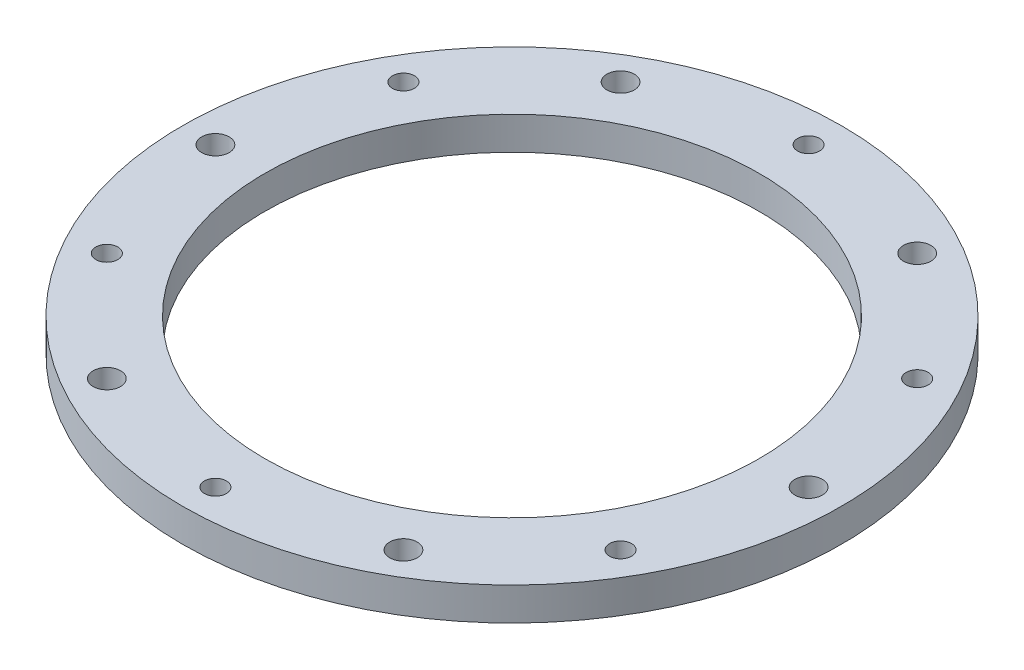
ISO-10303-21;
HEADER;
FILE_DESCRIPTION(('STEP AP214'),'2;1');
FILE_NAME('part.step','',(''),(''),'','','');
FILE_SCHEMA(('AUTOMOTIVE_DESIGN { 1 0 10303 214 1 1 1 1 }'));
ENDSEC;
DATA;
#1=APPLICATION_CONTEXT('core data for automotive mechanical design processes');
#2=APPLICATION_PROTOCOL_DEFINITION('international standard','automotive_design',2000,#1);
#3=PRODUCT_CONTEXT('',#1,'mechanical');
#4=PRODUCT('Part','Part','',(#3));
#5=PRODUCT_RELATED_PRODUCT_CATEGORY('part','',(#4));
#6=PRODUCT_DEFINITION_FORMATION('','',#4);
#7=PRODUCT_DEFINITION_CONTEXT('part definition',#1,'design');
#8=PRODUCT_DEFINITION('design','',#6,#7);
#9=PRODUCT_DEFINITION_SHAPE('','',#8);
#10=(LENGTH_UNIT() NAMED_UNIT(*) SI_UNIT(.MILLI.,.METRE.));
#11=(NAMED_UNIT(*) PLANE_ANGLE_UNIT() SI_UNIT($,.RADIAN.));
#12=(NAMED_UNIT(*) SI_UNIT($,.STERADIAN.) SOLID_ANGLE_UNIT());
#13=UNCERTAINTY_MEASURE_WITH_UNIT(LENGTH_MEASURE(1.E-05),#10,'distance_accuracy_value','');
#14=(GEOMETRIC_REPRESENTATION_CONTEXT(3) GLOBAL_UNCERTAINTY_ASSIGNED_CONTEXT((#13)) GLOBAL_UNIT_ASSIGNED_CONTEXT((#10,
#11,#12)) REPRESENTATION_CONTEXT('',''));
#15=CARTESIAN_POINT('',(0.,0.,0.));
#16=DIRECTION('',(0.,0.,1.));
#17=DIRECTION('',(1.,0.,0.));
#18=AXIS2_PLACEMENT_3D('',#15,#16,#17);
#19=CARTESIAN_POINT('',(0.,3.,0.));
#20=DIRECTION('',(0.,1.,0.));
#21=DIRECTION('',(0.,0.,1.));
#22=AXIS2_PLACEMENT_3D('',#19,#20,#21);
#23=PLANE('',#22);
#24=CARTESIAN_POINT('',(-26.9999999999996,3.,6.91674645454958E-13));
#25=DIRECTION('',(0.,1.,0.));
#26=DIRECTION('',(0.,0.,1.));
#27=AXIS2_PLACEMENT_3D('',#24,#25,#26);
#28=CIRCLE('',#27,1.25);
#29=CARTESIAN_POINT('',(-26.9999999999996,3.,1.25000000000069));
#30=VERTEX_POINT('',#29);
#31=EDGE_CURVE('E91',#30,#30,#28,.T.);
#32=ORIENTED_EDGE('',*,*,#31,.F.);
#33=EDGE_LOOP('',(#32));
#34=FACE_BOUND('',#33,.T.);
#35=CARTESIAN_POINT('',(-13.4999999999988,3.,23.3826859021806));
#36=DIRECTION('',(0.,1.,0.));
#37=DIRECTION('',(0.,0.,1.));
#38=AXIS2_PLACEMENT_3D('',#35,#36,#37);
#39=CIRCLE('',#38,1.25);
#40=CARTESIAN_POINT('',(-13.4999999999988,3.,24.6326859021806));
#41=VERTEX_POINT('',#40);
#42=EDGE_CURVE('E97',#41,#41,#39,.T.);
#43=ORIENTED_EDGE('',*,*,#42,.F.);
#44=EDGE_LOOP('',(#43));
#45=FACE_BOUND('',#44,.T.);
#46=CARTESIAN_POINT('',(13.5000000000016,3.,23.3826859021799));
#47=DIRECTION('',(0.,1.,0.));
#48=DIRECTION('',(0.,0.,1.));
#49=AXIS2_PLACEMENT_3D('',#46,#47,#48);
#50=CIRCLE('',#49,1.25);
#51=CARTESIAN_POINT('',(13.5000000000016,3.,24.6326859021799));
#52=VERTEX_POINT('',#51);
#53=EDGE_CURVE('E103',#52,#52,#50,.T.);
#54=ORIENTED_EDGE('',*,*,#53,.F.);
#55=EDGE_LOOP('',(#54));
#56=FACE_BOUND('',#55,.T.);
#57=CARTESIAN_POINT('',(27.0000000000013,3.,-6.77796857647143E-13));
#58=DIRECTION('',(0.,1.,0.));
#59=DIRECTION('',(0.,0.,1.));
#60=AXIS2_PLACEMENT_3D('',#57,#58,#59);
#61=CIRCLE('',#60,1.25);
#62=CARTESIAN_POINT('',(27.0000000000013,3.,1.24999999999932));
#63=VERTEX_POINT('',#62);
#64=EDGE_CURVE('E109',#63,#63,#61,.T.);
#65=ORIENTED_EDGE('',*,*,#64,.F.);
#66=EDGE_LOOP('',(#65));
#67=FACE_BOUND('',#66,.T.);
#68=CARTESIAN_POINT('',(13.5000000000005,3.,-23.3826859021805));
#69=DIRECTION('',(0.,1.,0.));
#70=DIRECTION('',(0.,0.,1.));
#71=AXIS2_PLACEMENT_3D('',#68,#69,#70);
#72=CIRCLE('',#71,1.25);
#73=CARTESIAN_POINT('',(13.5000000000005,3.,-22.1326859021805));
#74=VERTEX_POINT('',#73);
#75=EDGE_CURVE('E115',#74,#74,#72,.T.);
#76=ORIENTED_EDGE('',*,*,#75,.F.);
#77=EDGE_LOOP('',(#76));
#78=FACE_BOUND('',#77,.T.);
#79=CARTESIAN_POINT('',(-13.4999999999999,3.,-23.3826859021799));
#80=DIRECTION('',(0.,1.,0.));
#81=DIRECTION('',(0.,0.,1.));
#82=AXIS2_PLACEMENT_3D('',#79,#80,#81);
#83=CIRCLE('',#82,1.25);
#84=CARTESIAN_POINT('',(-13.4999999999999,3.,-22.1326859021799));
#85=VERTEX_POINT('',#84);
#86=EDGE_CURVE('E85',#85,#85,#83,.T.);
#87=ORIENTED_EDGE('',*,*,#86,.F.);
#88=EDGE_LOOP('',(#87));
#89=FACE_BOUND('',#88,.T.);
#90=CARTESIAN_POINT('',(-23.3826859021781,3.,13.500000000001));
#91=DIRECTION('',(0.,1.,0.));
#92=DIRECTION('',(0.,0.,1.));
#93=AXIS2_PLACEMENT_3D('',#90,#91,#92);
#94=CIRCLE('',#93,1.);
#95=CARTESIAN_POINT('',(-23.3826859021781,3.,14.500000000001));
#96=VERTEX_POINT('',#95);
#97=EDGE_CURVE('E70',#96,#96,#94,.T.);
#98=ORIENTED_EDGE('',*,*,#97,.F.);
#99=EDGE_LOOP('',(#98));
#100=FACE_BOUND('',#99,.T.);
#101=CARTESIAN_POINT('',(23.3826859021816,3.,13.499999999999));
#102=DIRECTION('',(0.,1.,0.));
#103=DIRECTION('',(0.,0.,1.));
#104=AXIS2_PLACEMENT_3D('',#101,#102,#103);
#105=CIRCLE('',#104,1.);
#106=CARTESIAN_POINT('',(23.3826859021816,3.,14.499999999999));
#107=VERTEX_POINT('',#106);
#108=EDGE_CURVE('E58',#107,#107,#105,.T.);
#109=ORIENTED_EDGE('',*,*,#108,.F.);
#110=EDGE_LOOP('',(#109));
#111=FACE_BOUND('',#110,.T.);
#112=CARTESIAN_POINT('',(0.,3.,0.));
#113=DIRECTION('',(0.,1.,0.));
#114=DIRECTION('',(0.,0.,1.));
#115=AXIS2_PLACEMENT_3D('',#112,#113,#114);
#116=CIRCLE('',#115,22.5);
#117=CARTESIAN_POINT('',(0.,3.,22.5));
#118=VERTEX_POINT('',#117);
#119=EDGE_CURVE('E46',#118,#118,#116,.T.);
#120=ORIENTED_EDGE('',*,*,#119,.F.);
#121=EDGE_LOOP('',(#120));
#122=FACE_BOUND('',#121,.T.);
#123=CARTESIAN_POINT('',(0.,3.,0.));
#124=DIRECTION('',(0.,1.,0.));
#125=DIRECTION('',(0.,0.,1.));
#126=AXIS2_PLACEMENT_3D('',#123,#124,#125);
#127=CIRCLE('',#126,30.);
#128=CARTESIAN_POINT('',(0.,3.,30.));
#129=VERTEX_POINT('',#128);
#130=EDGE_CURVE('E10',#129,#129,#127,.T.);
#131=ORIENTED_EDGE('',*,*,#130,.T.);
#132=EDGE_LOOP('',(#131));
#133=FACE_BOUND('',#132,.T.);
#134=CARTESIAN_POINT('',(0.,3.,-27.));
#135=DIRECTION('',(0.,1.,0.));
#136=DIRECTION('',(0.,0.,1.));
#137=AXIS2_PLACEMENT_3D('',#134,#135,#136);
#138=CIRCLE('',#137,1.);
#139=CARTESIAN_POINT('',(0.,3.,-26.));
#140=VERTEX_POINT('',#139);
#141=EDGE_CURVE('E41',#140,#140,#138,.T.);
#142=ORIENTED_EDGE('',*,*,#141,.F.);
#143=EDGE_LOOP('',(#142));
#144=FACE_BOUND('',#143,.T.);
#145=CARTESIAN_POINT('',(23.3826859021804,3.,-13.500000000001));
#146=DIRECTION('',(0.,1.,0.));
#147=DIRECTION('',(0.,0.,1.));
#148=AXIS2_PLACEMENT_3D('',#145,#146,#147);
#149=CIRCLE('',#148,1.);
#150=CARTESIAN_POINT('',(23.3826859021804,3.,-12.500000000001));
#151=VERTEX_POINT('',#150);
#152=EDGE_CURVE('E52',#151,#151,#149,.T.);
#153=ORIENTED_EDGE('',*,*,#152,.F.);
#154=EDGE_LOOP('',(#153));
#155=FACE_BOUND('',#154,.T.);
#156=CARTESIAN_POINT('',(2.33462645957541E-12,3.,27.));
#157=DIRECTION('',(0.,1.,0.));
#158=DIRECTION('',(0.,0.,1.));
#159=AXIS2_PLACEMENT_3D('',#156,#157,#158);
#160=CIRCLE('',#159,1.);
#161=CARTESIAN_POINT('',(2.33462645957541E-12,3.,28.));
#162=VERTEX_POINT('',#161);
#163=EDGE_CURVE('E64',#162,#162,#160,.T.);
#164=ORIENTED_EDGE('',*,*,#163,.F.);
#165=EDGE_LOOP('',(#164));
#166=FACE_BOUND('',#165,.T.);
#167=CARTESIAN_POINT('',(-23.3826859021793,3.,-13.499999999999));
#168=DIRECTION('',(0.,1.,0.));
#169=DIRECTION('',(0.,0.,1.));
#170=AXIS2_PLACEMENT_3D('',#167,#168,#169);
#171=CIRCLE('',#170,1.);
#172=CARTESIAN_POINT('',(-23.3826859021793,3.,-12.499999999999));
#173=VERTEX_POINT('',#172);
#174=EDGE_CURVE('E76',#173,#173,#171,.T.);
#175=ORIENTED_EDGE('',*,*,#174,.F.);
#176=EDGE_LOOP('',(#175));
#177=FACE_BOUND('',#176,.T.);
#178=ADVANCED_FACE('F30',(#34,#45,#56,#67,#78,#89,#100,#111,#122,#133,#144,#155,#166,#177),#23,.T.);
#179=CARTESIAN_POINT('',(0.,0.,0.));
#180=DIRECTION('',(0.,1.,0.));
#181=DIRECTION('',(0.,0.,1.));
#182=AXIS2_PLACEMENT_3D('',#179,#180,#181);
#183=PLANE('',#182);
#184=CARTESIAN_POINT('',(-26.9999999999996,0.,6.91674645454958E-13));
#185=DIRECTION('',(0.,1.,0.));
#186=DIRECTION('',(0.,0.,1.));
#187=AXIS2_PLACEMENT_3D('',#184,#185,#186);
#188=CIRCLE('',#187,1.25);
#189=CARTESIAN_POINT('',(-26.9999999999996,0.,1.25000000000069));
#190=VERTEX_POINT('',#189);
#191=EDGE_CURVE('E94',#190,#190,#188,.T.);
#192=ORIENTED_EDGE('',*,*,#191,.T.);
#193=EDGE_LOOP('',(#192));
#194=FACE_BOUND('',#193,.T.);
#195=CARTESIAN_POINT('',(-13.4999999999988,0.,23.3826859021806));
#196=DIRECTION('',(0.,1.,0.));
#197=DIRECTION('',(0.,0.,1.));
#198=AXIS2_PLACEMENT_3D('',#195,#196,#197);
#199=CIRCLE('',#198,1.25);
#200=CARTESIAN_POINT('',(-13.4999999999988,0.,24.6326859021806));
#201=VERTEX_POINT('',#200);
#202=EDGE_CURVE('E100',#201,#201,#199,.T.);
#203=ORIENTED_EDGE('',*,*,#202,.T.);
#204=EDGE_LOOP('',(#203));
#205=FACE_BOUND('',#204,.T.);
#206=CARTESIAN_POINT('',(13.5000000000016,0.,23.3826859021799));
#207=DIRECTION('',(0.,1.,0.));
#208=DIRECTION('',(0.,0.,1.));
#209=AXIS2_PLACEMENT_3D('',#206,#207,#208);
#210=CIRCLE('',#209,1.25);
#211=CARTESIAN_POINT('',(13.5000000000016,0.,24.6326859021799));
#212=VERTEX_POINT('',#211);
#213=EDGE_CURVE('E106',#212,#212,#210,.T.);
#214=ORIENTED_EDGE('',*,*,#213,.T.);
#215=EDGE_LOOP('',(#214));
#216=FACE_BOUND('',#215,.T.);
#217=CARTESIAN_POINT('',(27.0000000000013,0.,-6.77796857647143E-13));
#218=DIRECTION('',(0.,1.,0.));
#219=DIRECTION('',(0.,0.,1.));
#220=AXIS2_PLACEMENT_3D('',#217,#218,#219);
#221=CIRCLE('',#220,1.25);
#222=CARTESIAN_POINT('',(27.0000000000013,0.,1.24999999999932));
#223=VERTEX_POINT('',#222);
#224=EDGE_CURVE('E112',#223,#223,#221,.T.);
#225=ORIENTED_EDGE('',*,*,#224,.T.);
#226=EDGE_LOOP('',(#225));
#227=FACE_BOUND('',#226,.T.);
#228=CARTESIAN_POINT('',(13.5000000000005,0.,-23.3826859021805));
#229=DIRECTION('',(0.,1.,0.));
#230=DIRECTION('',(0.,0.,1.));
#231=AXIS2_PLACEMENT_3D('',#228,#229,#230);
#232=CIRCLE('',#231,1.25);
#233=CARTESIAN_POINT('',(13.5000000000005,0.,-22.1326859021805));
#234=VERTEX_POINT('',#233);
#235=EDGE_CURVE('E88',#234,#234,#232,.T.);
#236=ORIENTED_EDGE('',*,*,#235,.T.);
#237=EDGE_LOOP('',(#236));
#238=FACE_BOUND('',#237,.T.);
#239=CARTESIAN_POINT('',(-13.4999999999999,0.,-23.3826859021799));
#240=DIRECTION('',(0.,1.,0.));
#241=DIRECTION('',(0.,0.,1.));
#242=AXIS2_PLACEMENT_3D('',#239,#240,#241);
#243=CIRCLE('',#242,1.25);
#244=CARTESIAN_POINT('',(-13.4999999999999,0.,-22.1326859021799));
#245=VERTEX_POINT('',#244);
#246=EDGE_CURVE('E82',#245,#245,#243,.T.);
#247=ORIENTED_EDGE('',*,*,#246,.T.);
#248=EDGE_LOOP('',(#247));
#249=FACE_BOUND('',#248,.T.);
#250=CARTESIAN_POINT('',(0.,0.,0.));
#251=DIRECTION('',(0.,1.,0.));
#252=DIRECTION('',(0.,0.,1.));
#253=AXIS2_PLACEMENT_3D('',#250,#251,#252);
#254=CIRCLE('',#253,30.);
#255=CARTESIAN_POINT('',(0.,0.,30.));
#256=VERTEX_POINT('',#255);
#257=EDGE_CURVE('E34',#256,#256,#254,.T.);
#258=ORIENTED_EDGE('',*,*,#257,.F.);
#259=EDGE_LOOP('',(#258));
#260=FACE_BOUND('',#259,.T.);
#261=CARTESIAN_POINT('',(0.,0.,-27.));
#262=DIRECTION('',(0.,1.,0.));
#263=DIRECTION('',(0.,0.,1.));
#264=AXIS2_PLACEMENT_3D('',#261,#262,#263);
#265=CIRCLE('',#264,1.);
#266=CARTESIAN_POINT('',(0.,0.,-26.));
#267=VERTEX_POINT('',#266);
#268=EDGE_CURVE('E43',#267,#267,#265,.T.);
#269=ORIENTED_EDGE('',*,*,#268,.T.);
#270=EDGE_LOOP('',(#269));
#271=FACE_BOUND('',#270,.T.);
#272=CARTESIAN_POINT('',(0.,0.,0.));
#273=DIRECTION('',(0.,1.,0.));
#274=DIRECTION('',(0.,0.,1.));
#275=AXIS2_PLACEMENT_3D('',#272,#273,#274);
#276=CIRCLE('',#275,22.5);
#277=CARTESIAN_POINT('',(0.,0.,22.5));
#278=VERTEX_POINT('',#277);
#279=EDGE_CURVE('E49',#278,#278,#276,.T.);
#280=ORIENTED_EDGE('',*,*,#279,.T.);
#281=EDGE_LOOP('',(#280));
#282=FACE_BOUND('',#281,.T.);
#283=CARTESIAN_POINT('',(23.3826859021804,0.,-13.500000000001));
#284=DIRECTION('',(0.,1.,0.));
#285=DIRECTION('',(0.,0.,1.));
#286=AXIS2_PLACEMENT_3D('',#283,#284,#285);
#287=CIRCLE('',#286,1.);
#288=CARTESIAN_POINT('',(23.3826859021804,0.,-12.500000000001));
#289=VERTEX_POINT('',#288);
#290=EDGE_CURVE('E55',#289,#289,#287,.T.);
#291=ORIENTED_EDGE('',*,*,#290,.T.);
#292=EDGE_LOOP('',(#291));
#293=FACE_BOUND('',#292,.T.);
#294=CARTESIAN_POINT('',(23.3826859021816,0.,13.499999999999));
#295=DIRECTION('',(0.,1.,0.));
#296=DIRECTION('',(0.,0.,1.));
#297=AXIS2_PLACEMENT_3D('',#294,#295,#296);
#298=CIRCLE('',#297,1.);
#299=CARTESIAN_POINT('',(23.3826859021816,0.,14.499999999999));
#300=VERTEX_POINT('',#299);
#301=EDGE_CURVE('E61',#300,#300,#298,.T.);
#302=ORIENTED_EDGE('',*,*,#301,.T.);
#303=EDGE_LOOP('',(#302));
#304=FACE_BOUND('',#303,.T.);
#305=CARTESIAN_POINT('',(2.33462645957541E-12,0.,27.));
#306=DIRECTION('',(0.,1.,0.));
#307=DIRECTION('',(0.,0.,1.));
#308=AXIS2_PLACEMENT_3D('',#305,#306,#307);
#309=CIRCLE('',#308,1.);
#310=CARTESIAN_POINT('',(2.33462645957541E-12,0.,28.));
#311=VERTEX_POINT('',#310);
#312=EDGE_CURVE('E67',#311,#311,#309,.T.);
#313=ORIENTED_EDGE('',*,*,#312,.T.);
#314=EDGE_LOOP('',(#313));
#315=FACE_BOUND('',#314,.T.);
#316=CARTESIAN_POINT('',(-23.3826859021781,0.,13.500000000001));
#317=DIRECTION('',(0.,1.,0.));
#318=DIRECTION('',(0.,0.,1.));
#319=AXIS2_PLACEMENT_3D('',#316,#317,#318);
#320=CIRCLE('',#319,1.);
#321=CARTESIAN_POINT('',(-23.3826859021781,0.,14.500000000001));
#322=VERTEX_POINT('',#321);
#323=EDGE_CURVE('E73',#322,#322,#320,.T.);
#324=ORIENTED_EDGE('',*,*,#323,.T.);
#325=EDGE_LOOP('',(#324));
#326=FACE_BOUND('',#325,.T.);
#327=CARTESIAN_POINT('',(-23.3826859021793,0.,-13.499999999999));
#328=DIRECTION('',(0.,1.,0.));
#329=DIRECTION('',(0.,0.,1.));
#330=AXIS2_PLACEMENT_3D('',#327,#328,#329);
#331=CIRCLE('',#330,1.);
#332=CARTESIAN_POINT('',(-23.3826859021793,0.,-12.499999999999));
#333=VERTEX_POINT('',#332);
#334=EDGE_CURVE('E79',#333,#333,#331,.T.);
#335=ORIENTED_EDGE('',*,*,#334,.T.);
#336=EDGE_LOOP('',(#335));
#337=FACE_BOUND('',#336,.T.);
#338=ADVANCED_FACE('F121',(#194,#205,#216,#227,#238,#249,#260,#271,#282,#293,#304,#315,#326,
#337),#183,.F.);
#339=CARTESIAN_POINT('',(0.,3.,0.));
#340=DIRECTION('',(0.,-1.,0.));
#341=DIRECTION('',(0.,0.,-1.));
#342=AXIS2_PLACEMENT_3D('',#339,#340,#341);
#343=CYLINDRICAL_SURFACE('',#342,30.);
#344=ORIENTED_EDGE('',*,*,#130,.F.);
#345=EDGE_LOOP('',(#344));
#346=FACE_BOUND('',#345,.T.);
#347=ORIENTED_EDGE('',*,*,#257,.T.);
#348=EDGE_LOOP('',(#347));
#349=FACE_BOUND('',#348,.T.);
#350=ADVANCED_FACE('F32',(#346,#349),#343,.T.);
#351=CARTESIAN_POINT('',(0.,3.,-27.));
#352=DIRECTION('',(0.,-1.,0.));
#353=DIRECTION('',(0.,0.,-1.));
#354=AXIS2_PLACEMENT_3D('',#351,#352,#353);
#355=CYLINDRICAL_SURFACE('',#354,1.);
#356=ORIENTED_EDGE('',*,*,#141,.T.);
#357=EDGE_LOOP('',(#356));
#358=FACE_BOUND('',#357,.T.);
#359=ORIENTED_EDGE('',*,*,#268,.F.);
#360=EDGE_LOOP('',(#359));
#361=FACE_BOUND('',#360,.T.);
#362=ADVANCED_FACE('F164',(#358,#361),#355,.F.);
#363=CARTESIAN_POINT('',(0.,3.,0.));
#364=DIRECTION('',(0.,-1.,0.));
#365=DIRECTION('',(0.,0.,-1.));
#366=AXIS2_PLACEMENT_3D('',#363,#364,#365);
#367=CYLINDRICAL_SURFACE('',#366,22.5);
#368=ORIENTED_EDGE('',*,*,#119,.T.);
#369=EDGE_LOOP('',(#368));
#370=FACE_BOUND('',#369,.T.);
#371=ORIENTED_EDGE('',*,*,#279,.F.);
#372=EDGE_LOOP('',(#371));
#373=FACE_BOUND('',#372,.T.);
#374=ADVANCED_FACE('F170',(#370,#373),#367,.F.);
#375=CARTESIAN_POINT('',(23.3826859021804,3.,-13.500000000001));
#376=DIRECTION('',(0.,-1.,0.));
#377=DIRECTION('',(0.,0.,-1.));
#378=AXIS2_PLACEMENT_3D('',#375,#376,#377);
#379=CYLINDRICAL_SURFACE('',#378,1.);
#380=ORIENTED_EDGE('',*,*,#152,.T.);
#381=EDGE_LOOP('',(#380));
#382=FACE_BOUND('',#381,.T.);
#383=ORIENTED_EDGE('',*,*,#290,.F.);
#384=EDGE_LOOP('',(#383));
#385=FACE_BOUND('',#384,.T.);
#386=ADVANCED_FACE('F174',(#382,#385),#379,.F.);
#387=CARTESIAN_POINT('',(23.3826859021816,3.,13.499999999999));
#388=DIRECTION('',(0.,-1.,0.));
#389=DIRECTION('',(0.,0.,-1.));
#390=AXIS2_PLACEMENT_3D('',#387,#388,#389);
#391=CYLINDRICAL_SURFACE('',#390,1.);
#392=ORIENTED_EDGE('',*,*,#108,.T.);
#393=EDGE_LOOP('',(#392));
#394=FACE_BOUND('',#393,.T.);
#395=ORIENTED_EDGE('',*,*,#301,.F.);
#396=EDGE_LOOP('',(#395));
#397=FACE_BOUND('',#396,.T.);
#398=ADVANCED_FACE('F178',(#394,#397),#391,.F.);
#399=CARTESIAN_POINT('',(2.33462645957541E-12,3.,27.));
#400=DIRECTION('',(0.,-1.,0.));
#401=DIRECTION('',(0.,0.,-1.));
#402=AXIS2_PLACEMENT_3D('',#399,#400,#401);
#403=CYLINDRICAL_SURFACE('',#402,1.);
#404=ORIENTED_EDGE('',*,*,#163,.T.);
#405=EDGE_LOOP('',(#404));
#406=FACE_BOUND('',#405,.T.);
#407=ORIENTED_EDGE('',*,*,#312,.F.);
#408=EDGE_LOOP('',(#407));
#409=FACE_BOUND('',#408,.T.);
#410=ADVANCED_FACE('F182',(#406,#409),#403,.F.);
#411=CARTESIAN_POINT('',(-23.3826859021781,3.,13.500000000001));
#412=DIRECTION('',(0.,-1.,0.));
#413=DIRECTION('',(0.,0.,-1.));
#414=AXIS2_PLACEMENT_3D('',#411,#412,#413);
#415=CYLINDRICAL_SURFACE('',#414,1.);
#416=ORIENTED_EDGE('',*,*,#97,.T.);
#417=EDGE_LOOP('',(#416));
#418=FACE_BOUND('',#417,.T.);
#419=ORIENTED_EDGE('',*,*,#323,.F.);
#420=EDGE_LOOP('',(#419));
#421=FACE_BOUND('',#420,.T.);
#422=ADVANCED_FACE('F155',(#418,#421),#415,.F.);
#423=CARTESIAN_POINT('',(-23.3826859021793,3.,-13.499999999999));
#424=DIRECTION('',(0.,-1.,0.));
#425=DIRECTION('',(0.,0.,-1.));
#426=AXIS2_PLACEMENT_3D('',#423,#424,#425);
#427=CYLINDRICAL_SURFACE('',#426,1.);
#428=ORIENTED_EDGE('',*,*,#174,.T.);
#429=EDGE_LOOP('',(#428));
#430=FACE_BOUND('',#429,.T.);
#431=ORIENTED_EDGE('',*,*,#334,.F.);
#432=EDGE_LOOP('',(#431));
#433=FACE_BOUND('',#432,.T.);
#434=ADVANCED_FACE('F152',(#430,#433),#427,.F.);
#435=CARTESIAN_POINT('',(-13.4999999999999,0.,-23.3826859021799));
#436=DIRECTION('',(0.,1.,0.));
#437=DIRECTION('',(0.,0.,1.));
#438=AXIS2_PLACEMENT_3D('',#435,#436,#437);
#439=CYLINDRICAL_SURFACE('',#438,1.25);
#440=ORIENTED_EDGE('',*,*,#246,.F.);
#441=EDGE_LOOP('',(#440));
#442=FACE_BOUND('',#441,.T.);
#443=ORIENTED_EDGE('',*,*,#86,.T.);
#444=EDGE_LOOP('',(#443));
#445=FACE_BOUND('',#444,.T.);
#446=ADVANCED_FACE('F128',(#442,#445),#439,.F.);
#447=CARTESIAN_POINT('',(13.5000000000005,0.,-23.3826859021805));
#448=DIRECTION('',(0.,1.,0.));
#449=DIRECTION('',(0.,0.,1.));
#450=AXIS2_PLACEMENT_3D('',#447,#448,#449);
#451=CYLINDRICAL_SURFACE('',#450,1.25);
#452=ORIENTED_EDGE('',*,*,#235,.F.);
#453=EDGE_LOOP('',(#452));
#454=FACE_BOUND('',#453,.T.);
#455=ORIENTED_EDGE('',*,*,#75,.T.);
#456=EDGE_LOOP('',(#455));
#457=FACE_BOUND('',#456,.T.);
#458=ADVANCED_FACE('F124',(#454,#457),#451,.F.);
#459=CARTESIAN_POINT('',(27.0000000000013,0.,-6.77796857647143E-13));
#460=DIRECTION('',(0.,1.,0.));
#461=DIRECTION('',(0.,0.,1.));
#462=AXIS2_PLACEMENT_3D('',#459,#460,#461);
#463=CYLINDRICAL_SURFACE('',#462,1.25);
#464=ORIENTED_EDGE('',*,*,#224,.F.);
#465=EDGE_LOOP('',(#464));
#466=FACE_BOUND('',#465,.T.);
#467=ORIENTED_EDGE('',*,*,#64,.T.);
#468=EDGE_LOOP('',(#467));
#469=FACE_BOUND('',#468,.T.);
#470=ADVANCED_FACE('F127',(#466,#469),#463,.F.);
#471=CARTESIAN_POINT('',(13.5000000000016,0.,23.3826859021799));
#472=DIRECTION('',(0.,1.,0.));
#473=DIRECTION('',(0.,0.,1.));
#474=AXIS2_PLACEMENT_3D('',#471,#472,#473);
#475=CYLINDRICAL_SURFACE('',#474,1.25);
#476=ORIENTED_EDGE('',*,*,#213,.F.);
#477=EDGE_LOOP('',(#476));
#478=FACE_BOUND('',#477,.T.);
#479=ORIENTED_EDGE('',*,*,#53,.T.);
#480=EDGE_LOOP('',(#479));
#481=FACE_BOUND('',#480,.T.);
#482=ADVANCED_FACE('F200',(#478,#481),#475,.F.);
#483=CARTESIAN_POINT('',(-13.4999999999988,0.,23.3826859021806));
#484=DIRECTION('',(0.,1.,0.));
#485=DIRECTION('',(0.,0.,1.));
#486=AXIS2_PLACEMENT_3D('',#483,#484,#485);
#487=CYLINDRICAL_SURFACE('',#486,1.25);
#488=ORIENTED_EDGE('',*,*,#202,.F.);
#489=EDGE_LOOP('',(#488));
#490=FACE_BOUND('',#489,.T.);
#491=ORIENTED_EDGE('',*,*,#42,.T.);
#492=EDGE_LOOP('',(#491));
#493=FACE_BOUND('',#492,.T.);
#494=ADVANCED_FACE('F196',(#490,#493),#487,.F.);
#495=CARTESIAN_POINT('',(-26.9999999999996,0.,6.91674645454958E-13));
#496=DIRECTION('',(0.,1.,0.));
#497=DIRECTION('',(0.,0.,1.));
#498=AXIS2_PLACEMENT_3D('',#495,#496,#497);
#499=CYLINDRICAL_SURFACE('',#498,1.25);
#500=ORIENTED_EDGE('',*,*,#191,.F.);
#501=EDGE_LOOP('',(#500));
#502=FACE_BOUND('',#501,.T.);
#503=ORIENTED_EDGE('',*,*,#31,.T.);
#504=EDGE_LOOP('',(#503));
#505=FACE_BOUND('',#504,.T.);
#506=ADVANCED_FACE('F193',(#502,#505),#499,.F.);
#507=CLOSED_SHELL('',(#178,#338,#350,#362,#374,#386,#398,#410,#422,#434,#446,#458,#470,#482,
#494,#506));
#508=MANIFOLD_SOLID_BREP('B2',#507);
#509=ADVANCED_BREP_SHAPE_REPRESENTATION('',(#18,#508),#14);
#510=SHAPE_DEFINITION_REPRESENTATION(#9,#509);
ENDSEC;
END-ISO-10303-21;
